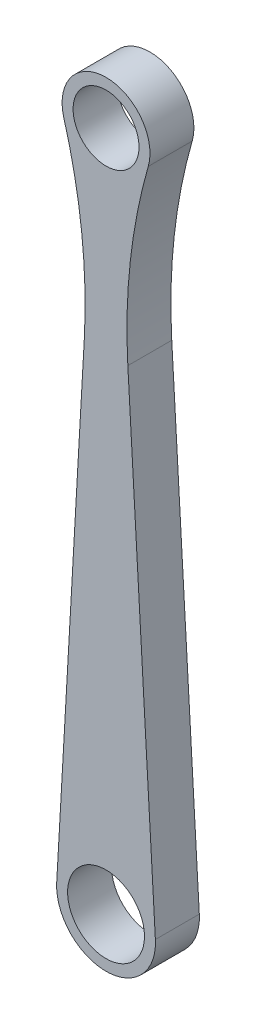
ISO-10303-21;
HEADER;
FILE_DESCRIPTION(('STEP AP214'),'2;1');
FILE_NAME('part.step','',(''),(''),'','','');
FILE_SCHEMA(('AUTOMOTIVE_DESIGN { 1 0 10303 214 1 1 1 1 }'));
ENDSEC;
DATA;
#1=APPLICATION_CONTEXT('core data for automotive mechanical design processes');
#2=APPLICATION_PROTOCOL_DEFINITION('international standard','automotive_design',2000,#1);
#3=PRODUCT_CONTEXT('',#1,'mechanical');
#4=PRODUCT('Part','Part','',(#3));
#5=PRODUCT_RELATED_PRODUCT_CATEGORY('part','',(#4));
#6=PRODUCT_DEFINITION_FORMATION('','',#4);
#7=PRODUCT_DEFINITION_CONTEXT('part definition',#1,'design');
#8=PRODUCT_DEFINITION('design','',#6,#7);
#9=PRODUCT_DEFINITION_SHAPE('','',#8);
#10=(LENGTH_UNIT() NAMED_UNIT(*) SI_UNIT(.MILLI.,.METRE.));
#11=(NAMED_UNIT(*) PLANE_ANGLE_UNIT() SI_UNIT($,.RADIAN.));
#12=(NAMED_UNIT(*) SI_UNIT($,.STERADIAN.) SOLID_ANGLE_UNIT());
#13=UNCERTAINTY_MEASURE_WITH_UNIT(LENGTH_MEASURE(1.E-05),#10,'distance_accuracy_value','');
#14=(GEOMETRIC_REPRESENTATION_CONTEXT(3) GLOBAL_UNCERTAINTY_ASSIGNED_CONTEXT((#13)) GLOBAL_UNIT_ASSIGNED_CONTEXT((#10,
#11,#12)) REPRESENTATION_CONTEXT('',''));
#15=CARTESIAN_POINT('',(0.,0.,0.));
#16=DIRECTION('',(0.,0.,1.));
#17=DIRECTION('',(1.,0.,0.));
#18=AXIS2_PLACEMENT_3D('',#15,#16,#17);
#19=CARTESIAN_POINT('',(51.9039817293315,-14.8988818587579,2.));
#20=DIRECTION('',(0.,0.,-1.));
#21=DIRECTION('',(-1.,0.,0.));
#22=AXIS2_PLACEMENT_3D('',#19,#20,#21);
#23=CYLINDRICAL_SURFACE('',#22,50.);
#24=CARTESIAN_POINT('',(51.9039817293315,-14.8988818587579,-2.));
#25=DIRECTION('',(0.,0.,1.));
#26=DIRECTION('',(1.,0.,0.));
#27=AXIS2_PLACEMENT_3D('',#24,#25,#26);
#28=CIRCLE('',#27,50.);
#29=CARTESIAN_POINT('',(3.84473938735789,-1.10362087842651,-2.));
#30=VERTEX_POINT('',#29);
#31=CARTESIAN_POINT('',(1.98499116174982,-17.7439443736589,-2.));
#32=VERTEX_POINT('',#31);
#33=EDGE_CURVE('E134',#30,#32,#28,.T.);
#34=ORIENTED_EDGE('',*,*,#33,.F.);
#35=DIRECTION('',(0.,0.,-1.));
#36=VECTOR('',#35,1.);
#37=CARTESIAN_POINT('',(3.84473938735789,-1.10362087842651,2.));
#38=LINE('',#37,#36);
#39=CARTESIAN_POINT('',(3.84473938735789,-1.10362087842651,2.));
#40=VERTEX_POINT('',#39);
#41=EDGE_CURVE('E11',#40,#30,#38,.T.);
#42=ORIENTED_EDGE('',*,*,#41,.F.);
#43=CARTESIAN_POINT('',(51.9039817293315,-14.8988818587579,2.));
#44=DIRECTION('',(0.,0.,1.));
#45=DIRECTION('',(1.,0.,0.));
#46=AXIS2_PLACEMENT_3D('',#43,#44,#45);
#47=CIRCLE('',#46,50.);
#48=CARTESIAN_POINT('',(1.98499116174982,-17.7439443736589,2.));
#49=VERTEX_POINT('',#48);
#50=EDGE_CURVE('E152',#40,#49,#47,.T.);
#51=ORIENTED_EDGE('',*,*,#50,.T.);
#52=DIRECTION('',(0.,0.,-1.));
#53=VECTOR('',#52,1.);
#54=CARTESIAN_POINT('',(1.98499116174982,-17.7439443736589,2.));
#55=LINE('',#54,#53);
#56=EDGE_CURVE('E61',#49,#32,#55,.T.);
#57=ORIENTED_EDGE('',*,*,#56,.T.);
#58=EDGE_LOOP('',(#34,#42,#51,#57));
#59=FACE_BOUND('',#58,.T.);
#60=ADVANCED_FACE('F45',(#59),#23,.F.);
#61=CARTESIAN_POINT('',(0.,0.,2.));
#62=DIRECTION('',(0.,0.,-1.));
#63=DIRECTION('',(-1.,0.,0.));
#64=AXIS2_PLACEMENT_3D('',#61,#62,#63);
#65=CYLINDRICAL_SURFACE('',#64,4.);
#66=CARTESIAN_POINT('',(0.,0.,-2.));
#67=DIRECTION('',(0.,0.,1.));
#68=DIRECTION('',(1.,0.,0.));
#69=AXIS2_PLACEMENT_3D('',#66,#67,#68);
#70=CIRCLE('',#69,4.);
#71=CARTESIAN_POINT('',(-3.84473938735789,-1.10362087842651,-2.));
#72=VERTEX_POINT('',#71);
#73=EDGE_CURVE('E136',#30,#72,#70,.T.);
#74=ORIENTED_EDGE('',*,*,#73,.T.);
#75=DIRECTION('',(0.,0.,-1.));
#76=VECTOR('',#75,1.);
#77=CARTESIAN_POINT('',(-3.84473938735789,-1.10362087842651,2.));
#78=LINE('',#77,#76);
#79=CARTESIAN_POINT('',(-3.84473938735789,-1.10362087842651,2.));
#80=VERTEX_POINT('',#79);
#81=EDGE_CURVE('E53',#80,#72,#78,.T.);
#82=ORIENTED_EDGE('',*,*,#81,.F.);
#83=CARTESIAN_POINT('',(0.,0.,2.));
#84=DIRECTION('',(0.,0.,1.));
#85=DIRECTION('',(1.,0.,0.));
#86=AXIS2_PLACEMENT_3D('',#83,#84,#85);
#87=CIRCLE('',#86,4.);
#88=EDGE_CURVE('E267',#40,#80,#87,.T.);
#89=ORIENTED_EDGE('',*,*,#88,.F.);
#90=ORIENTED_EDGE('',*,*,#41,.T.);
#91=EDGE_LOOP('',(#74,#82,#89,#90));
#92=FACE_BOUND('',#91,.T.);
#93=ADVANCED_FACE('F180',(#92),#65,.T.);
#94=CARTESIAN_POINT('',(-51.9039817293315,-14.8988818587579,2.));
#95=DIRECTION('',(0.,0.,-1.));
#96=DIRECTION('',(-1.,0.,0.));
#97=AXIS2_PLACEMENT_3D('',#94,#95,#96);
#98=CYLINDRICAL_SURFACE('',#97,50.);
#99=CARTESIAN_POINT('',(-51.9039817293315,-14.8988818587579,-2.));
#100=DIRECTION('',(0.,0.,1.));
#101=DIRECTION('',(1.,0.,0.));
#102=AXIS2_PLACEMENT_3D('',#99,#100,#101);
#103=CIRCLE('',#102,50.);
#104=CARTESIAN_POINT('',(-1.98499116174982,-17.7439443736589,-2.));
#105=VERTEX_POINT('',#104);
#106=EDGE_CURVE('E138',#72,#105,#103,.F.);
#107=ORIENTED_EDGE('',*,*,#106,.T.);
#108=DIRECTION('',(0.,0.,-1.));
#109=VECTOR('',#108,1.);
#110=CARTESIAN_POINT('',(-1.98499116174982,-17.7439443736589,2.));
#111=LINE('',#110,#109);
#112=CARTESIAN_POINT('',(-1.98499116174982,-17.7439443736589,2.));
#113=VERTEX_POINT('',#112);
#114=EDGE_CURVE('E120',#113,#105,#111,.T.);
#115=ORIENTED_EDGE('',*,*,#114,.F.);
#116=CARTESIAN_POINT('',(-51.9039817293315,-14.8988818587579,2.));
#117=DIRECTION('',(0.,0.,1.));
#118=DIRECTION('',(1.,0.,0.));
#119=AXIS2_PLACEMENT_3D('',#116,#117,#118);
#120=CIRCLE('',#119,50.);
#121=EDGE_CURVE('E108',#80,#113,#120,.F.);
#122=ORIENTED_EDGE('',*,*,#121,.F.);
#123=ORIENTED_EDGE('',*,*,#81,.T.);
#124=EDGE_LOOP('',(#107,#115,#122,#123));
#125=FACE_BOUND('',#124,.T.);
#126=ADVANCED_FACE('F159',(#125),#98,.F.);
#127=CARTESIAN_POINT('',(-0.970547459713344,0.0553149846414576,2.));
#128=DIRECTION('',(0.998379811351633,-0.0569012502980205,0.));
#129=DIRECTION('',(0.0569012502980205,0.998379811351633,0.));
#130=AXIS2_PLACEMENT_3D('',#127,#128,#129);
#131=PLANE('',#130);
#132=DIRECTION('',(-0.0569012502980205,-0.998379811351633,0.));
#133=VECTOR('',#132,1.);
#134=CARTESIAN_POINT('',(-0.970547459713344,0.0553149846414576,-2.));
#135=LINE('',#134,#133);
#136=CARTESIAN_POINT('',(-4.49270915108235,-61.7439443736589,-2.));
#137=VERTEX_POINT('',#136);
#138=EDGE_CURVE('E117',#105,#137,#135,.T.);
#139=ORIENTED_EDGE('',*,*,#138,.T.);
#140=DIRECTION('',(0.,0.,-1.));
#141=VECTOR('',#140,1.);
#142=CARTESIAN_POINT('',(-4.49270915108235,-61.7439443736589,2.));
#143=LINE('',#142,#141);
#144=CARTESIAN_POINT('',(-4.49270915108235,-61.7439443736589,2.));
#145=VERTEX_POINT('',#144);
#146=EDGE_CURVE('E114',#145,#137,#143,.T.);
#147=ORIENTED_EDGE('',*,*,#146,.F.);
#148=DIRECTION('',(-0.0569012502980205,-0.998379811351633,0.));
#149=VECTOR('',#148,1.);
#150=CARTESIAN_POINT('',(-0.970547459713344,0.0553149846414576,2.));
#151=LINE('',#150,#149);
#152=EDGE_CURVE('E99',#113,#145,#151,.T.);
#153=ORIENTED_EDGE('',*,*,#152,.F.);
#154=ORIENTED_EDGE('',*,*,#114,.T.);
#155=EDGE_LOOP('',(#139,#147,#153,#154));
#156=FACE_BOUND('',#155,.T.);
#157=ADVANCED_FACE('F115',(#156),#131,.F.);
#158=CARTESIAN_POINT('',(0.,-62.,2.));
#159=DIRECTION('',(0.,0.,-1.));
#160=DIRECTION('',(-1.,0.,0.));
#161=AXIS2_PLACEMENT_3D('',#158,#159,#160);
#162=CYLINDRICAL_SURFACE('',#161,4.5);
#163=CARTESIAN_POINT('',(0.,-62.,-2.));
#164=DIRECTION('',(0.,0.,1.));
#165=DIRECTION('',(1.,0.,0.));
#166=AXIS2_PLACEMENT_3D('',#163,#164,#165);
#167=CIRCLE('',#166,4.5);
#168=CARTESIAN_POINT('',(4.49270915108235,-61.7439443736589,-2.));
#169=VERTEX_POINT('',#168);
#170=EDGE_CURVE('E141',#137,#169,#167,.T.);
#171=ORIENTED_EDGE('',*,*,#170,.T.);
#172=DIRECTION('',(0.,0.,-1.));
#173=VECTOR('',#172,1.);
#174=CARTESIAN_POINT('',(4.49270915108235,-61.7439443736589,2.));
#175=LINE('',#174,#173);
#176=CARTESIAN_POINT('',(4.49270915108235,-61.7439443736589,2.));
#177=VERTEX_POINT('',#176);
#178=EDGE_CURVE('E81',#177,#169,#175,.T.);
#179=ORIENTED_EDGE('',*,*,#178,.F.);
#180=CARTESIAN_POINT('',(0.,-62.,2.));
#181=DIRECTION('',(0.,0.,1.));
#182=DIRECTION('',(1.,0.,0.));
#183=AXIS2_PLACEMENT_3D('',#180,#181,#182);
#184=CIRCLE('',#183,4.5);
#185=EDGE_CURVE('E106',#145,#177,#184,.T.);
#186=ORIENTED_EDGE('',*,*,#185,.F.);
#187=ORIENTED_EDGE('',*,*,#146,.T.);
#188=EDGE_LOOP('',(#171,#179,#186,#187));
#189=FACE_BOUND('',#188,.T.);
#190=ADVANCED_FACE('F122',(#189),#162,.T.);
#191=CARTESIAN_POINT('',(0.,-62.,2.));
#192=DIRECTION('',(0.,0.,-1.));
#193=DIRECTION('',(-1.,0.,0.));
#194=AXIS2_PLACEMENT_3D('',#191,#192,#193);
#195=CYLINDRICAL_SURFACE('',#194,3.5);
#196=CARTESIAN_POINT('',(0.,-62.,2.));
#197=DIRECTION('',(0.,0.,1.));
#198=DIRECTION('',(1.,0.,0.));
#199=AXIS2_PLACEMENT_3D('',#196,#197,#198);
#200=CIRCLE('',#199,3.5);
#201=CARTESIAN_POINT('',(3.5,-62.,2.));
#202=VERTEX_POINT('',#201);
#203=EDGE_CURVE('E125',#202,#202,#200,.T.);
#204=ORIENTED_EDGE('',*,*,#203,.T.);
#205=EDGE_LOOP('',(#204));
#206=FACE_BOUND('',#205,.T.);
#207=CARTESIAN_POINT('',(0.,-62.,-2.));
#208=DIRECTION('',(0.,0.,1.));
#209=DIRECTION('',(1.,0.,0.));
#210=AXIS2_PLACEMENT_3D('',#207,#208,#209);
#211=CIRCLE('',#210,3.5);
#212=CARTESIAN_POINT('',(3.5,-62.,-2.));
#213=VERTEX_POINT('',#212);
#214=EDGE_CURVE('E146',#213,#213,#211,.T.);
#215=ORIENTED_EDGE('',*,*,#214,.F.);
#216=EDGE_LOOP('',(#215));
#217=FACE_BOUND('',#216,.T.);
#218=ADVANCED_FACE('F168',(#206,#217),#195,.F.);
#219=CARTESIAN_POINT('',(0.970547459713344,0.0553149846414576,2.));
#220=DIRECTION('',(0.998379811351633,0.0569012502980205,0.));
#221=DIRECTION('',(-0.0569012502980205,0.998379811351633,0.));
#222=AXIS2_PLACEMENT_3D('',#219,#220,#221);
#223=PLANE('',#222);
#224=DIRECTION('',(0.0569012502980205,-0.998379811351633,0.));
#225=VECTOR('',#224,1.);
#226=CARTESIAN_POINT('',(0.970547459713344,0.0553149846414576,-2.));
#227=LINE('',#226,#225);
#228=EDGE_CURVE('E143',#32,#169,#227,.T.);
#229=ORIENTED_EDGE('',*,*,#228,.F.);
#230=ORIENTED_EDGE('',*,*,#56,.F.);
#231=DIRECTION('',(0.0569012502980205,-0.998379811351633,0.));
#232=VECTOR('',#231,1.);
#233=CARTESIAN_POINT('',(0.970547459713344,0.0553149846414576,2.));
#234=LINE('',#233,#232);
#235=EDGE_CURVE('E123',#49,#177,#234,.T.);
#236=ORIENTED_EDGE('',*,*,#235,.T.);
#237=ORIENTED_EDGE('',*,*,#178,.T.);
#238=EDGE_LOOP('',(#229,#230,#236,#237));
#239=FACE_BOUND('',#238,.T.);
#240=ADVANCED_FACE('F165',(#239),#223,.T.);
#241=CARTESIAN_POINT('',(0.,0.,2.));
#242=DIRECTION('',(0.,0.,-1.));
#243=DIRECTION('',(-1.,0.,0.));
#244=AXIS2_PLACEMENT_3D('',#241,#242,#243);
#245=CYLINDRICAL_SURFACE('',#244,3.);
#246=CARTESIAN_POINT('',(0.,0.,2.));
#247=DIRECTION('',(0.,0.,1.));
#248=DIRECTION('',(1.,0.,0.));
#249=AXIS2_PLACEMENT_3D('',#246,#247,#248);
#250=CIRCLE('',#249,3.);
#251=CARTESIAN_POINT('',(3.,0.,2.));
#252=VERTEX_POINT('',#251);
#253=EDGE_CURVE('E131',#252,#252,#250,.T.);
#254=ORIENTED_EDGE('',*,*,#253,.T.);
#255=EDGE_LOOP('',(#254));
#256=FACE_BOUND('',#255,.T.);
#257=CARTESIAN_POINT('',(0.,0.,-2.));
#258=DIRECTION('',(0.,0.,1.));
#259=DIRECTION('',(1.,0.,0.));
#260=AXIS2_PLACEMENT_3D('',#257,#258,#259);
#261=CIRCLE('',#260,3.);
#262=CARTESIAN_POINT('',(3.,0.,-2.));
#263=VERTEX_POINT('',#262);
#264=EDGE_CURVE('E149',#263,#263,#261,.T.);
#265=ORIENTED_EDGE('',*,*,#264,.F.);
#266=EDGE_LOOP('',(#265));
#267=FACE_BOUND('',#266,.T.);
#268=ADVANCED_FACE('F167',(#256,#267),#245,.F.);
#269=CARTESIAN_POINT('',(0.,0.,2.));
#270=DIRECTION('',(0.,0.,1.));
#271=DIRECTION('',(1.,0.,0.));
#272=AXIS2_PLACEMENT_3D('',#269,#270,#271);
#273=PLANE('',#272);
#274=ORIENTED_EDGE('',*,*,#50,.F.);
#275=ORIENTED_EDGE('',*,*,#88,.T.);
#276=ORIENTED_EDGE('',*,*,#121,.T.);
#277=ORIENTED_EDGE('',*,*,#152,.T.);
#278=ORIENTED_EDGE('',*,*,#185,.T.);
#279=ORIENTED_EDGE('',*,*,#235,.F.);
#280=EDGE_LOOP('',(#274,#275,#276,#277,#278,#279));
#281=FACE_BOUND('',#280,.T.);
#282=ORIENTED_EDGE('',*,*,#203,.F.);
#283=EDGE_LOOP('',(#282));
#284=FACE_BOUND('',#283,.T.);
#285=ORIENTED_EDGE('',*,*,#253,.F.);
#286=EDGE_LOOP('',(#285));
#287=FACE_BOUND('',#286,.T.);
#288=ADVANCED_FACE('F102',(#281,#284,#287),#273,.T.);
#289=CARTESIAN_POINT('',(0.,0.,-2.));
#290=DIRECTION('',(0.,0.,1.));
#291=DIRECTION('',(1.,0.,0.));
#292=AXIS2_PLACEMENT_3D('',#289,#290,#291);
#293=PLANE('',#292);
#294=ORIENTED_EDGE('',*,*,#33,.T.);
#295=ORIENTED_EDGE('',*,*,#228,.T.);
#296=ORIENTED_EDGE('',*,*,#170,.F.);
#297=ORIENTED_EDGE('',*,*,#138,.F.);
#298=ORIENTED_EDGE('',*,*,#106,.F.);
#299=ORIENTED_EDGE('',*,*,#73,.F.);
#300=EDGE_LOOP('',(#294,#295,#296,#297,#298,#299));
#301=FACE_BOUND('',#300,.T.);
#302=ORIENTED_EDGE('',*,*,#214,.T.);
#303=EDGE_LOOP('',(#302));
#304=FACE_BOUND('',#303,.T.);
#305=ORIENTED_EDGE('',*,*,#264,.T.);
#306=EDGE_LOOP('',(#305));
#307=FACE_BOUND('',#306,.T.);
#308=ADVANCED_FACE('F163',(#301,#304,#307),#293,.F.);
#309=CLOSED_SHELL('',(#60,#93,#126,#157,#190,#218,#240,#268,#288,#308));
#310=MANIFOLD_SOLID_BREP('B2',#309);
#311=ADVANCED_BREP_SHAPE_REPRESENTATION('',(#18,#310),#14);
#312=SHAPE_DEFINITION_REPRESENTATION(#9,#311);
ENDSEC;
END-ISO-10303-21;
